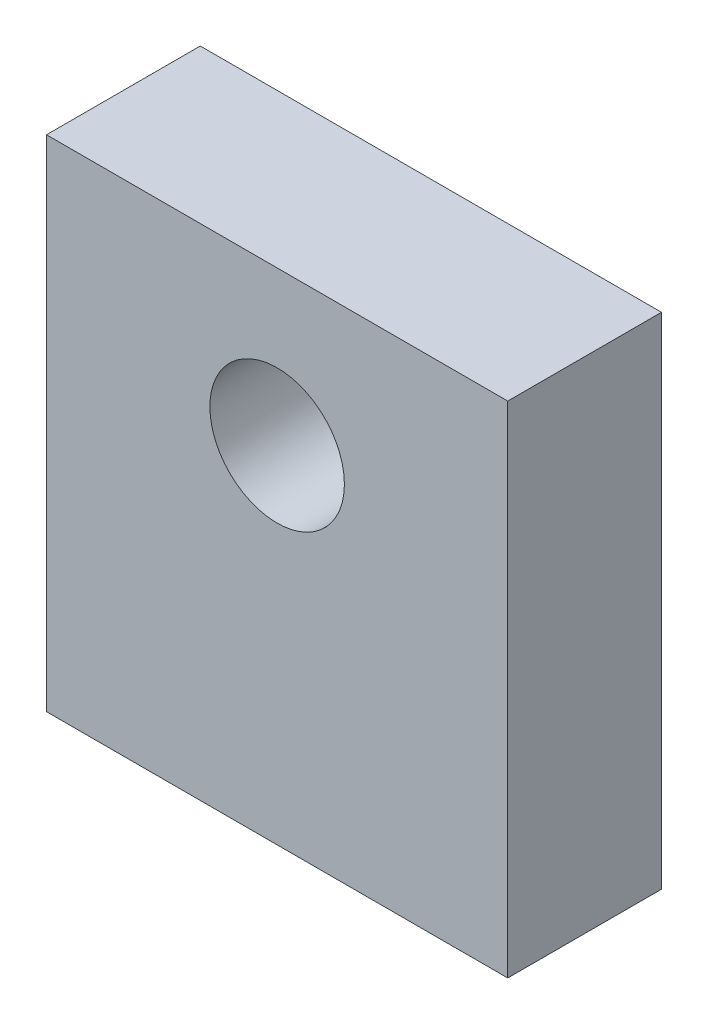
ISO-10303-21;
HEADER;
FILE_DESCRIPTION(('STEP AP214'),'2;1');
FILE_NAME('part.step','',(''),(''),'','','');
FILE_SCHEMA(('AUTOMOTIVE_DESIGN { 1 0 10303 214 1 1 1 1 }'));
ENDSEC;
DATA;
#1=APPLICATION_CONTEXT('core data for automotive mechanical design processes');
#2=APPLICATION_PROTOCOL_DEFINITION('international standard','automotive_design',2000,#1);
#3=PRODUCT_CONTEXT('',#1,'mechanical');
#4=PRODUCT('Part','Part','',(#3));
#5=PRODUCT_RELATED_PRODUCT_CATEGORY('part','',(#4));
#6=PRODUCT_DEFINITION_FORMATION('','',#4);
#7=PRODUCT_DEFINITION_CONTEXT('part definition',#1,'design');
#8=PRODUCT_DEFINITION('design','',#6,#7);
#9=PRODUCT_DEFINITION_SHAPE('','',#8);
#10=(LENGTH_UNIT() NAMED_UNIT(*) SI_UNIT(.MILLI.,.METRE.));
#11=(NAMED_UNIT(*) PLANE_ANGLE_UNIT() SI_UNIT($,.RADIAN.));
#12=(NAMED_UNIT(*) SI_UNIT($,.STERADIAN.) SOLID_ANGLE_UNIT());
#13=UNCERTAINTY_MEASURE_WITH_UNIT(LENGTH_MEASURE(1.E-05),#10,'distance_accuracy_value','');
#14=(GEOMETRIC_REPRESENTATION_CONTEXT(3) GLOBAL_UNCERTAINTY_ASSIGNED_CONTEXT((#13)) GLOBAL_UNIT_ASSIGNED_CONTEXT((#10,
#11,#12)) REPRESENTATION_CONTEXT('',''));
#15=CARTESIAN_POINT('',(0.,0.,0.));
#16=DIRECTION('',(0.,0.,1.));
#17=DIRECTION('',(1.,0.,0.));
#18=AXIS2_PLACEMENT_3D('',#15,#16,#17);
#19=CARTESIAN_POINT('',(0.,0.,12.7));
#20=DIRECTION('',(0.,0.,1.));
#21=DIRECTION('',(1.,0.,0.));
#22=AXIS2_PLACEMENT_3D('',#19,#20,#21);
#23=PLANE('',#22);
#24=DIRECTION('',(0.,1.,0.));
#25=VECTOR('',#24,1.);
#26=CARTESIAN_POINT('',(19.05,0.,12.7));
#27=LINE('',#26,#25);
#28=CARTESIAN_POINT('',(19.05,0.,12.7));
#29=VERTEX_POINT('',#28);
#30=CARTESIAN_POINT('',(19.05,41.275,12.7));
#31=VERTEX_POINT('',#30);
#32=EDGE_CURVE('E118',#29,#31,#27,.T.);
#33=ORIENTED_EDGE('',*,*,#32,.T.);
#34=DIRECTION('',(-1.,0.,0.));
#35=VECTOR('',#34,1.);
#36=CARTESIAN_POINT('',(19.05,41.275,12.7));
#37=LINE('',#36,#35);
#38=CARTESIAN_POINT('',(-19.05,41.275,12.7));
#39=VERTEX_POINT('',#38);
#40=EDGE_CURVE('E83',#31,#39,#37,.T.);
#41=ORIENTED_EDGE('',*,*,#40,.T.);
#42=DIRECTION('',(0.,-1.,0.));
#43=VECTOR('',#42,1.);
#44=CARTESIAN_POINT('',(-19.05,0.,12.7));
#45=LINE('',#44,#43);
#46=CARTESIAN_POINT('',(-19.05,0.,12.7));
#47=VERTEX_POINT('',#46);
#48=EDGE_CURVE('E121',#39,#47,#45,.T.);
#49=ORIENTED_EDGE('',*,*,#48,.T.);
#50=DIRECTION('',(1.,0.,0.));
#51=VECTOR('',#50,1.);
#52=CARTESIAN_POINT('',(19.05,0.,12.7));
#53=LINE('',#52,#51);
#54=EDGE_CURVE('E52',#47,#29,#53,.T.);
#55=ORIENTED_EDGE('',*,*,#54,.T.);
#56=EDGE_LOOP('',(#33,#41,#49,#55));
#57=FACE_BOUND('',#56,.T.);
#58=CARTESIAN_POINT('',(0.,28.575,12.7));
#59=DIRECTION('',(0.,0.,1.));
#60=DIRECTION('',(1.,0.,0.));
#61=AXIS2_PLACEMENT_3D('',#58,#59,#60);
#62=CIRCLE('',#61,5.55625);
#63=CARTESIAN_POINT('',(5.55625,28.575,12.7));
#64=VERTEX_POINT('',#63);
#65=EDGE_CURVE('E112',#64,#64,#62,.T.);
#66=ORIENTED_EDGE('',*,*,#65,.F.);
#67=EDGE_LOOP('',(#66));
#68=FACE_BOUND('',#67,.T.);
#69=ADVANCED_FACE('F35',(#57,#68),#23,.T.);
#70=CARTESIAN_POINT('',(0.,0.,0.));
#71=DIRECTION('',(0.,0.,1.));
#72=DIRECTION('',(1.,0.,0.));
#73=AXIS2_PLACEMENT_3D('',#70,#71,#72);
#74=PLANE('',#73);
#75=DIRECTION('',(0.,1.,0.));
#76=VECTOR('',#75,1.);
#77=CARTESIAN_POINT('',(19.05,0.,0.));
#78=LINE('',#77,#76);
#79=CARTESIAN_POINT('',(19.05,0.,0.));
#80=VERTEX_POINT('',#79);
#81=CARTESIAN_POINT('',(19.05,41.275,0.));
#82=VERTEX_POINT('',#81);
#83=EDGE_CURVE('E115',#80,#82,#78,.T.);
#84=ORIENTED_EDGE('',*,*,#83,.F.);
#85=DIRECTION('',(1.,0.,0.));
#86=VECTOR('',#85,1.);
#87=CARTESIAN_POINT('',(19.05,0.,0.));
#88=LINE('',#87,#86);
#89=CARTESIAN_POINT('',(-19.05,0.,0.));
#90=VERTEX_POINT('',#89);
#91=EDGE_CURVE('E76',#90,#80,#88,.T.);
#92=ORIENTED_EDGE('',*,*,#91,.F.);
#93=DIRECTION('',(0.,-1.,0.));
#94=VECTOR('',#93,1.);
#95=CARTESIAN_POINT('',(-19.05,0.,0.));
#96=LINE('',#95,#94);
#97=CARTESIAN_POINT('',(-19.05,41.275,0.));
#98=VERTEX_POINT('',#97);
#99=EDGE_CURVE('E70',#98,#90,#96,.T.);
#100=ORIENTED_EDGE('',*,*,#99,.F.);
#101=DIRECTION('',(-1.,0.,0.));
#102=VECTOR('',#101,1.);
#103=CARTESIAN_POINT('',(19.05,41.275,0.));
#104=LINE('',#103,#102);
#105=EDGE_CURVE('E127',#82,#98,#104,.T.);
#106=ORIENTED_EDGE('',*,*,#105,.F.);
#107=EDGE_LOOP('',(#84,#92,#100,#106));
#108=FACE_BOUND('',#107,.T.);
#109=CARTESIAN_POINT('',(0.,28.575,0.));
#110=DIRECTION('',(0.,0.,1.));
#111=DIRECTION('',(1.,0.,0.));
#112=AXIS2_PLACEMENT_3D('',#109,#110,#111);
#113=CIRCLE('',#112,5.55625);
#114=CARTESIAN_POINT('',(5.55625,28.575,0.));
#115=VERTEX_POINT('',#114);
#116=EDGE_CURVE('E111',#115,#115,#113,.T.);
#117=ORIENTED_EDGE('',*,*,#116,.T.);
#118=EDGE_LOOP('',(#117));
#119=FACE_BOUND('',#118,.T.);
#120=ADVANCED_FACE('F137',(#108,#119),#74,.F.);
#121=CARTESIAN_POINT('',(19.05,0.,12.7));
#122=DIRECTION('',(-1.,0.,0.));
#123=DIRECTION('',(0.,0.,1.));
#124=AXIS2_PLACEMENT_3D('',#121,#122,#123);
#125=PLANE('',#124);
#126=ORIENTED_EDGE('',*,*,#83,.T.);
#127=DIRECTION('',(0.,0.,-1.));
#128=VECTOR('',#127,1.);
#129=CARTESIAN_POINT('',(19.05,41.275,12.7));
#130=LINE('',#129,#128);
#131=EDGE_CURVE('E11',#31,#82,#130,.T.);
#132=ORIENTED_EDGE('',*,*,#131,.F.);
#133=ORIENTED_EDGE('',*,*,#32,.F.);
#134=DIRECTION('',(0.,0.,-1.));
#135=VECTOR('',#134,1.);
#136=CARTESIAN_POINT('',(19.05,0.,12.7));
#137=LINE('',#136,#135);
#138=EDGE_CURVE('E124',#29,#80,#137,.T.);
#139=ORIENTED_EDGE('',*,*,#138,.T.);
#140=EDGE_LOOP('',(#126,#132,#133,#139));
#141=FACE_BOUND('',#140,.T.);
#142=ADVANCED_FACE('F37',(#141),#125,.F.);
#143=CARTESIAN_POINT('',(19.05,41.275,12.7));
#144=DIRECTION('',(0.,-1.,0.));
#145=DIRECTION('',(0.,0.,-1.));
#146=AXIS2_PLACEMENT_3D('',#143,#144,#145);
#147=PLANE('',#146);
#148=ORIENTED_EDGE('',*,*,#105,.T.);
#149=DIRECTION('',(0.,0.,-1.));
#150=VECTOR('',#149,1.);
#151=CARTESIAN_POINT('',(-19.05,41.275,12.7));
#152=LINE('',#151,#150);
#153=EDGE_CURVE('E44',#39,#98,#152,.T.);
#154=ORIENTED_EDGE('',*,*,#153,.F.);
#155=ORIENTED_EDGE('',*,*,#40,.F.);
#156=ORIENTED_EDGE('',*,*,#131,.T.);
#157=EDGE_LOOP('',(#148,#154,#155,#156));
#158=FACE_BOUND('',#157,.T.);
#159=ADVANCED_FACE('F154',(#158),#147,.F.);
#160=CARTESIAN_POINT('',(-19.05,0.,12.7));
#161=DIRECTION('',(1.,0.,0.));
#162=DIRECTION('',(0.,0.,-1.));
#163=AXIS2_PLACEMENT_3D('',#160,#161,#162);
#164=PLANE('',#163);
#165=ORIENTED_EDGE('',*,*,#99,.T.);
#166=DIRECTION('',(0.,0.,-1.));
#167=VECTOR('',#166,1.);
#168=CARTESIAN_POINT('',(-19.05,0.,12.7));
#169=LINE('',#168,#167);
#170=EDGE_CURVE('E132',#47,#90,#169,.T.);
#171=ORIENTED_EDGE('',*,*,#170,.F.);
#172=ORIENTED_EDGE('',*,*,#48,.F.);
#173=ORIENTED_EDGE('',*,*,#153,.T.);
#174=EDGE_LOOP('',(#165,#171,#172,#173));
#175=FACE_BOUND('',#174,.T.);
#176=ADVANCED_FACE('F134',(#175),#164,.F.);
#177=CARTESIAN_POINT('',(19.05,0.,12.7));
#178=DIRECTION('',(0.,1.,0.));
#179=DIRECTION('',(0.,0.,1.));
#180=AXIS2_PLACEMENT_3D('',#177,#178,#179);
#181=PLANE('',#180);
#182=CARTESIAN_POINT('',(13.97,0.,6.35));
#183=DIRECTION('',(0.,-1.,0.));
#184=DIRECTION('',(0.,0.,-1.));
#185=AXIS2_PLACEMENT_3D('',#182,#183,#184);
#186=CIRCLE('',#185,2.01929999999999);
#187=CARTESIAN_POINT('',(13.97,0.,4.33070000000001));
#188=VERTEX_POINT('',#187);
#189=EDGE_CURVE('E101',#188,#188,#186,.T.);
#190=ORIENTED_EDGE('',*,*,#189,.F.);
#191=EDGE_LOOP('',(#190));
#192=FACE_BOUND('',#191,.T.);
#193=CARTESIAN_POINT('',(-13.97,0.,6.35));
#194=DIRECTION('',(0.,-1.,0.));
#195=DIRECTION('',(0.,0.,-1.));
#196=AXIS2_PLACEMENT_3D('',#193,#194,#195);
#197=CIRCLE('',#196,2.01929999999999);
#198=CARTESIAN_POINT('',(-13.97,0.,4.33070000000001));
#199=VERTEX_POINT('',#198);
#200=EDGE_CURVE('E100',#199,#199,#197,.T.);
#201=ORIENTED_EDGE('',*,*,#200,.F.);
#202=EDGE_LOOP('',(#201));
#203=FACE_BOUND('',#202,.T.);
#204=ORIENTED_EDGE('',*,*,#91,.T.);
#205=ORIENTED_EDGE('',*,*,#138,.F.);
#206=ORIENTED_EDGE('',*,*,#54,.F.);
#207=ORIENTED_EDGE('',*,*,#170,.T.);
#208=EDGE_LOOP('',(#204,#205,#206,#207));
#209=FACE_BOUND('',#208,.T.);
#210=ADVANCED_FACE('F142',(#192,#203,#209),#181,.F.);
#211=CARTESIAN_POINT('',(0.,28.575,12.7));
#212=DIRECTION('',(0.,0.,-1.));
#213=DIRECTION('',(-1.,0.,0.));
#214=AXIS2_PLACEMENT_3D('',#211,#212,#213);
#215=CYLINDRICAL_SURFACE('',#214,5.55625);
#216=ORIENTED_EDGE('',*,*,#65,.T.);
#217=EDGE_LOOP('',(#216));
#218=FACE_BOUND('',#217,.T.);
#219=ORIENTED_EDGE('',*,*,#116,.F.);
#220=EDGE_LOOP('',(#219));
#221=FACE_BOUND('',#220,.T.);
#222=ADVANCED_FACE('F144',(#218,#221),#215,.F.);
#223=CARTESIAN_POINT('',(-13.97,15.875,6.35));
#224=DIRECTION('',(0.,-1.,0.));
#225=DIRECTION('',(0.,0.,-1.));
#226=AXIS2_PLACEMENT_3D('',#223,#224,#225);
#227=CONICAL_SURFACE('',#226,2.0193,1.02974425867665);
#228=CARTESIAN_POINT('',(-13.97,17.0883178480024,6.35));
#229=VERTEX_POINT('',#228);
#230=VERTEX_LOOP('',#229);
#231=FACE_BOUND('',#230,.T.);
#232=CARTESIAN_POINT('',(-13.97,15.875,6.35));
#233=DIRECTION('',(0.,-1.,0.));
#234=DIRECTION('',(0.,0.,-1.));
#235=AXIS2_PLACEMENT_3D('',#232,#233,#234);
#236=CIRCLE('',#235,2.0193);
#237=CARTESIAN_POINT('',(-13.97,15.875,4.3307));
#238=VERTEX_POINT('',#237);
#239=EDGE_CURVE('E104',#238,#238,#236,.T.);
#240=ORIENTED_EDGE('',*,*,#239,.T.);
#241=EDGE_LOOP('',(#240));
#242=FACE_BOUND('',#241,.T.);
#243=ADVANCED_FACE('F151',(#231,#242),#227,.F.);
#244=CARTESIAN_POINT('',(-13.97,0.,6.35));
#245=DIRECTION('',(0.,-1.,0.));
#246=DIRECTION('',(0.,0.,-1.));
#247=AXIS2_PLACEMENT_3D('',#244,#245,#246);
#248=CYLINDRICAL_SURFACE('',#247,2.01929999999999);
#249=ORIENTED_EDGE('',*,*,#239,.F.);
#250=EDGE_LOOP('',(#249));
#251=FACE_BOUND('',#250,.T.);
#252=ORIENTED_EDGE('',*,*,#200,.T.);
#253=EDGE_LOOP('',(#252));
#254=FACE_BOUND('',#253,.T.);
#255=ADVANCED_FACE('F94',(#251,#254),#248,.F.);
#256=CARTESIAN_POINT('',(13.97,15.875,6.35));
#257=DIRECTION('',(0.,-1.,0.));
#258=DIRECTION('',(0.,0.,-1.));
#259=AXIS2_PLACEMENT_3D('',#256,#257,#258);
#260=CONICAL_SURFACE('',#259,2.01929999999999,1.02974425867665);
#261=CARTESIAN_POINT('',(13.97,17.0883178480024,6.35));
#262=VERTEX_POINT('',#261);
#263=VERTEX_LOOP('',#262);
#264=FACE_BOUND('',#263,.T.);
#265=CARTESIAN_POINT('',(13.97,15.875,6.35));
#266=DIRECTION('',(0.,-1.,0.));
#267=DIRECTION('',(0.,0.,-1.));
#268=AXIS2_PLACEMENT_3D('',#265,#266,#267);
#269=CIRCLE('',#268,2.01929999999999);
#270=CARTESIAN_POINT('',(13.97,15.875,4.3307));
#271=VERTEX_POINT('',#270);
#272=EDGE_CURVE('E98',#271,#271,#269,.T.);
#273=ORIENTED_EDGE('',*,*,#272,.T.);
#274=EDGE_LOOP('',(#273));
#275=FACE_BOUND('',#274,.T.);
#276=ADVANCED_FACE('F90',(#264,#275),#260,.F.);
#277=CARTESIAN_POINT('',(13.97,0.,6.35));
#278=DIRECTION('',(0.,-1.,0.));
#279=DIRECTION('',(0.,0.,-1.));
#280=AXIS2_PLACEMENT_3D('',#277,#278,#279);
#281=CYLINDRICAL_SURFACE('',#280,2.01929999999999);
#282=ORIENTED_EDGE('',*,*,#272,.F.);
#283=EDGE_LOOP('',(#282));
#284=FACE_BOUND('',#283,.T.);
#285=ORIENTED_EDGE('',*,*,#189,.T.);
#286=EDGE_LOOP('',(#285));
#287=FACE_BOUND('',#286,.T.);
#288=ADVANCED_FACE('F93',(#284,#287),#281,.F.);
#289=CLOSED_SHELL('',(#69,#120,#142,#159,#176,#210,#222,#243,#255,#276,#288));
#290=MANIFOLD_SOLID_BREP('B2',#289);
#291=ADVANCED_BREP_SHAPE_REPRESENTATION('',(#18,#290),#14);
#292=SHAPE_DEFINITION_REPRESENTATION(#9,#291);
ENDSEC;
END-ISO-10303-21;
